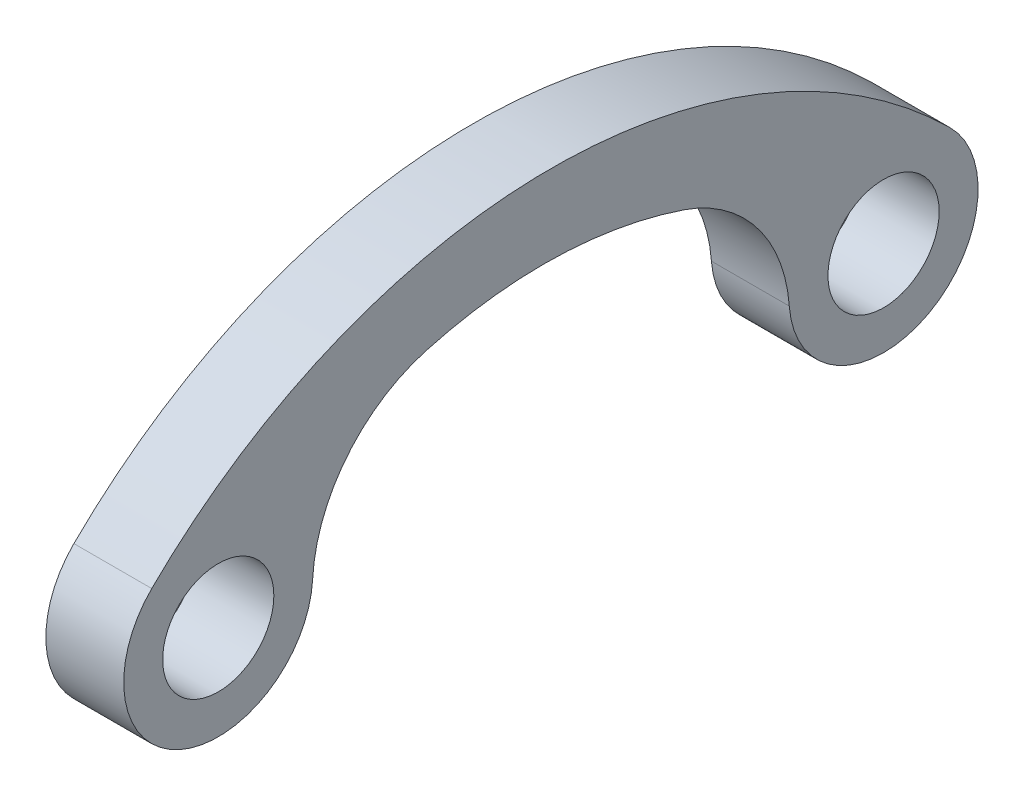
ISO-10303-21;
HEADER;
FILE_DESCRIPTION(('STEP AP214'),'2;1');
FILE_NAME('part.step','',(''),(''),'','','');
FILE_SCHEMA(('AUTOMOTIVE_DESIGN { 1 0 10303 214 1 1 1 1 }'));
ENDSEC;
DATA;
#1=APPLICATION_CONTEXT('core data for automotive mechanical design processes');
#2=APPLICATION_PROTOCOL_DEFINITION('international standard','automotive_design',2000,#1);
#3=PRODUCT_CONTEXT('',#1,'mechanical');
#4=PRODUCT('Part','Part','',(#3));
#5=PRODUCT_RELATED_PRODUCT_CATEGORY('part','',(#4));
#6=PRODUCT_DEFINITION_FORMATION('','',#4);
#7=PRODUCT_DEFINITION_CONTEXT('part definition',#1,'design');
#8=PRODUCT_DEFINITION('design','',#6,#7);
#9=PRODUCT_DEFINITION_SHAPE('','',#8);
#10=(LENGTH_UNIT() NAMED_UNIT(*) SI_UNIT(.MILLI.,.METRE.));
#11=(NAMED_UNIT(*) PLANE_ANGLE_UNIT() SI_UNIT($,.RADIAN.));
#12=(NAMED_UNIT(*) SI_UNIT($,.STERADIAN.) SOLID_ANGLE_UNIT());
#13=UNCERTAINTY_MEASURE_WITH_UNIT(LENGTH_MEASURE(1.E-05),#10,'distance_accuracy_value','');
#14=(GEOMETRIC_REPRESENTATION_CONTEXT(3) GLOBAL_UNCERTAINTY_ASSIGNED_CONTEXT((#13)) GLOBAL_UNIT_ASSIGNED_CONTEXT((#10,
#11,#12)) REPRESENTATION_CONTEXT('',''));
#15=CARTESIAN_POINT('',(0.,0.,0.));
#16=DIRECTION('',(0.,0.,1.));
#17=DIRECTION('',(1.,0.,0.));
#18=AXIS2_PLACEMENT_3D('',#15,#16,#17);
#19=CARTESIAN_POINT('',(5.,-10.7894564722716,10.68));
#20=DIRECTION('',(1.,0.,0.));
#21=DIRECTION('',(0.,0.,-1.));
#22=AXIS2_PLACEMENT_3D('',#19,#20,#21);
#23=PLANE('',#22);
#24=CARTESIAN_POINT('',(5.,0.,0.));
#25=DIRECTION('',(1.,0.,0.));
#26=DIRECTION('',(0.,0.,-1.));
#27=AXIS2_PLACEMENT_3D('',#24,#25,#26);
#28=CIRCLE('',#27,3.57);
#29=CARTESIAN_POINT('',(5.,0.,-3.57));
#30=VERTEX_POINT('',#29);
#31=EDGE_CURVE('E134',#30,#30,#28,.T.);
#32=ORIENTED_EDGE('',*,*,#31,.F.);
#33=EDGE_LOOP('',(#32));
#34=FACE_BOUND('',#33,.T.);
#35=CARTESIAN_POINT('',(5.,0.,0.));
#36=DIRECTION('',(1.,0.,0.));
#37=DIRECTION('',(0.,0.,-1.));
#38=AXIS2_PLACEMENT_3D('',#35,#36,#37);
#39=CIRCLE('',#38,6.07000000000001);
#40=CARTESIAN_POINT('',(5.,-0.44795040481959,6.05344863981038));
#41=VERTEX_POINT('',#40);
#42=CARTESIAN_POINT('',(5.,4.31396445430394,-4.27020030993888));
#43=VERTEX_POINT('',#42);
#44=EDGE_CURVE('E146',#41,#43,#39,.T.);
#45=ORIENTED_EDGE('',*,*,#44,.T.);
#46=CARTESIAN_POINT('',(5.,-21.5789129445431,21.36));
#47=DIRECTION('',(1.,0.,0.));
#48=DIRECTION('',(0.,0.,-1.));
#49=AXIS2_PLACEMENT_3D('',#46,#47,#48);
#50=CIRCLE('',#49,36.4327911080021);
#51=CARTESIAN_POINT('',(5.,4.31396445430393,46.9902003099389));
#52=VERTEX_POINT('',#51);
#53=EDGE_CURVE('E94',#43,#52,#50,.T.);
#54=ORIENTED_EDGE('',*,*,#53,.T.);
#55=CARTESIAN_POINT('',(5.,0.,42.72));
#56=DIRECTION('',(1.,0.,0.));
#57=DIRECTION('',(0.,0.,-1.));
#58=AXIS2_PLACEMENT_3D('',#55,#56,#57);
#59=CIRCLE('',#58,6.06999999999999);
#60=CARTESIAN_POINT('',(5.,-0.338492916093118,36.6594453598903));
#61=VERTEX_POINT('',#60);
#62=EDGE_CURVE('E107',#52,#61,#59,.T.);
#63=ORIENTED_EDGE('',*,*,#62,.T.);
#64=CARTESIAN_POINT('',(5.,-0.896141871765454,26.6750060845861));
#65=DIRECTION('',(-1.,0.,0.));
#66=DIRECTION('',(0.,0.,-1.));
#67=AXIS2_PLACEMENT_3D('',#64,#65,#66);
#68=CIRCLE('',#67,10.);
#69=CARTESIAN_POINT('',(5.,8.73212241093731,29.3762144998015));
#70=VERTEX_POINT('',#69);
#71=EDGE_CURVE('E101',#61,#70,#68,.T.);
#72=ORIENTED_EDGE('',*,*,#71,.T.);
#73=CARTESIAN_POINT('',(5.,-18.2093448184513,21.817789028555));
#74=DIRECTION('',(-1.,0.,0.));
#75=DIRECTION('',(0.,0.,-1.));
#76=AXIS2_PLACEMENT_3D('',#73,#74,#75);
#77=CIRCLE('',#76,27.9816449137039);
#78=CARTESIAN_POINT('',(5.,8.28118476907602,12.8053368512091));
#79=VERTEX_POINT('',#78);
#80=EDGE_CURVE('E105',#70,#79,#77,.T.);
#81=ORIENTED_EDGE('',*,*,#80,.T.);
#82=CARTESIAN_POINT('',(5.,-1.18592471259486,16.026181160091));
#83=DIRECTION('',(-1.,0.,0.));
#84=DIRECTION('',(0.,0.,1.));
#85=AXIS2_PLACEMENT_3D('',#82,#83,#84);
#86=CIRCLE('',#85,10.);
#87=EDGE_CURVE('E57',#79,#41,#86,.T.);
#88=ORIENTED_EDGE('',*,*,#87,.T.);
#89=EDGE_LOOP('',(#45,#54,#63,#72,#81,#88));
#90=FACE_BOUND('',#89,.T.);
#91=CARTESIAN_POINT('',(5.,0.,42.72));
#92=DIRECTION('',(1.,0.,0.));
#93=DIRECTION('',(0.,0.,-1.));
#94=AXIS2_PLACEMENT_3D('',#91,#92,#93);
#95=CIRCLE('',#94,3.57);
#96=CARTESIAN_POINT('',(5.,0.,39.15));
#97=VERTEX_POINT('',#96);
#98=EDGE_CURVE('E192',#97,#97,#95,.T.);
#99=ORIENTED_EDGE('',*,*,#98,.F.);
#100=EDGE_LOOP('',(#99));
#101=FACE_BOUND('',#100,.T.);
#102=ADVANCED_FACE('F39',(#34,#90,#101),#23,.T.);
#103=CARTESIAN_POINT('',(0.,-10.7894564722716,10.68));
#104=DIRECTION('',(1.,0.,0.));
#105=DIRECTION('',(0.,0.,-1.));
#106=AXIS2_PLACEMENT_3D('',#103,#104,#105);
#107=PLANE('',#106);
#108=CARTESIAN_POINT('',(0.,0.,0.));
#109=DIRECTION('',(1.,0.,0.));
#110=DIRECTION('',(0.,0.,-1.));
#111=AXIS2_PLACEMENT_3D('',#108,#109,#110);
#112=CIRCLE('',#111,6.07000000000001);
#113=CARTESIAN_POINT('',(0.,-0.44795040481959,6.05344863981038));
#114=VERTEX_POINT('',#113);
#115=CARTESIAN_POINT('',(0.,4.31396445430394,-4.27020030993888));
#116=VERTEX_POINT('',#115);
#117=EDGE_CURVE('E129',#114,#116,#112,.T.);
#118=ORIENTED_EDGE('',*,*,#117,.F.);
#119=CARTESIAN_POINT('',(0.,-1.18592471259486,16.026181160091));
#120=DIRECTION('',(-1.,0.,0.));
#121=DIRECTION('',(0.,0.,1.));
#122=AXIS2_PLACEMENT_3D('',#119,#120,#121);
#123=CIRCLE('',#122,10.);
#124=CARTESIAN_POINT('',(0.,8.28118476907602,12.8053368512091));
#125=VERTEX_POINT('',#124);
#126=EDGE_CURVE('E86',#125,#114,#123,.T.);
#127=ORIENTED_EDGE('',*,*,#126,.F.);
#128=CARTESIAN_POINT('',(0.,-18.2093448184513,21.817789028555));
#129=DIRECTION('',(-1.,0.,0.));
#130=DIRECTION('',(0.,0.,-1.));
#131=AXIS2_PLACEMENT_3D('',#128,#129,#130);
#132=CIRCLE('',#131,27.9816449137039);
#133=CARTESIAN_POINT('',(0.,8.73212241093731,29.3762144998015));
#134=VERTEX_POINT('',#133);
#135=EDGE_CURVE('E80',#134,#125,#132,.T.);
#136=ORIENTED_EDGE('',*,*,#135,.F.);
#137=CARTESIAN_POINT('',(0.,-0.896141871765454,26.6750060845861));
#138=DIRECTION('',(-1.,0.,0.));
#139=DIRECTION('',(0.,0.,-1.));
#140=AXIS2_PLACEMENT_3D('',#137,#138,#139);
#141=CIRCLE('',#140,10.);
#142=CARTESIAN_POINT('',(0.,-0.338492916093118,36.6594453598903));
#143=VERTEX_POINT('',#142);
#144=EDGE_CURVE('E116',#143,#134,#141,.T.);
#145=ORIENTED_EDGE('',*,*,#144,.F.);
#146=CARTESIAN_POINT('',(0.,0.,42.72));
#147=DIRECTION('',(1.,0.,0.));
#148=DIRECTION('',(0.,0.,-1.));
#149=AXIS2_PLACEMENT_3D('',#146,#147,#148);
#150=CIRCLE('',#149,6.06999999999999);
#151=CARTESIAN_POINT('',(0.,4.31396445430393,46.9902003099389));
#152=VERTEX_POINT('',#151);
#153=EDGE_CURVE('E137',#152,#143,#150,.T.);
#154=ORIENTED_EDGE('',*,*,#153,.F.);
#155=CARTESIAN_POINT('',(0.,-21.5789129445431,21.36));
#156=DIRECTION('',(1.,0.,0.));
#157=DIRECTION('',(0.,0.,-1.));
#158=AXIS2_PLACEMENT_3D('',#155,#156,#157);
#159=CIRCLE('',#158,36.4327911080021);
#160=EDGE_CURVE('E133',#116,#152,#159,.T.);
#161=ORIENTED_EDGE('',*,*,#160,.F.);
#162=EDGE_LOOP('',(#118,#127,#136,#145,#154,#161));
#163=FACE_BOUND('',#162,.T.);
#164=CARTESIAN_POINT('',(0.,0.,0.));
#165=DIRECTION('',(1.,0.,0.));
#166=DIRECTION('',(0.,0.,-1.));
#167=AXIS2_PLACEMENT_3D('',#164,#165,#166);
#168=CIRCLE('',#167,3.57);
#169=CARTESIAN_POINT('',(0.,0.,-3.57));
#170=VERTEX_POINT('',#169);
#171=EDGE_CURVE('E200',#170,#170,#168,.T.);
#172=ORIENTED_EDGE('',*,*,#171,.T.);
#173=EDGE_LOOP('',(#172));
#174=FACE_BOUND('',#173,.T.);
#175=CARTESIAN_POINT('',(0.,0.,42.72));
#176=DIRECTION('',(1.,0.,0.));
#177=DIRECTION('',(0.,0.,-1.));
#178=AXIS2_PLACEMENT_3D('',#175,#176,#177);
#179=CIRCLE('',#178,3.57);
#180=CARTESIAN_POINT('',(0.,0.,39.15));
#181=VERTEX_POINT('',#180);
#182=EDGE_CURVE('E195',#181,#181,#179,.T.);
#183=ORIENTED_EDGE('',*,*,#182,.T.);
#184=EDGE_LOOP('',(#183));
#185=FACE_BOUND('',#184,.T.);
#186=ADVANCED_FACE('F159',(#163,#174,#185),#107,.F.);
#187=CARTESIAN_POINT('',(5.,0.,0.));
#188=DIRECTION('',(-1.,0.,0.));
#189=DIRECTION('',(0.,0.,1.));
#190=AXIS2_PLACEMENT_3D('',#187,#188,#189);
#191=CYLINDRICAL_SURFACE('',#190,6.07000000000001);
#192=ORIENTED_EDGE('',*,*,#117,.T.);
#193=DIRECTION('',(-1.,0.,0.));
#194=VECTOR('',#193,1.);
#195=CARTESIAN_POINT('',(5.,4.31396445430394,-4.27020030993888));
#196=LINE('',#195,#194);
#197=EDGE_CURVE('E11',#43,#116,#196,.T.);
#198=ORIENTED_EDGE('',*,*,#197,.F.);
#199=ORIENTED_EDGE('',*,*,#44,.F.);
#200=DIRECTION('',(-1.,0.,0.));
#201=VECTOR('',#200,1.);
#202=CARTESIAN_POINT('',(5.,-0.44795040481959,6.05344863981038));
#203=LINE('',#202,#201);
#204=EDGE_CURVE('E125',#41,#114,#203,.T.);
#205=ORIENTED_EDGE('',*,*,#204,.T.);
#206=EDGE_LOOP('',(#192,#198,#199,#205));
#207=FACE_BOUND('',#206,.T.);
#208=ADVANCED_FACE('F41',(#207),#191,.T.);
#209=CARTESIAN_POINT('',(5.,-21.5789129445431,21.36));
#210=DIRECTION('',(-1.,0.,0.));
#211=DIRECTION('',(0.,0.,1.));
#212=AXIS2_PLACEMENT_3D('',#209,#210,#211);
#213=CYLINDRICAL_SURFACE('',#212,36.4327911080021);
#214=ORIENTED_EDGE('',*,*,#160,.T.);
#215=DIRECTION('',(-1.,0.,0.));
#216=VECTOR('',#215,1.);
#217=CARTESIAN_POINT('',(5.,4.31396445430393,46.9902003099389));
#218=LINE('',#217,#216);
#219=EDGE_CURVE('E49',#52,#152,#218,.T.);
#220=ORIENTED_EDGE('',*,*,#219,.F.);
#221=ORIENTED_EDGE('',*,*,#53,.F.);
#222=ORIENTED_EDGE('',*,*,#197,.T.);
#223=EDGE_LOOP('',(#214,#220,#221,#222));
#224=FACE_BOUND('',#223,.T.);
#225=ADVANCED_FACE('F246',(#224),#213,.T.);
#226=CARTESIAN_POINT('',(5.,0.,42.72));
#227=DIRECTION('',(-1.,0.,0.));
#228=DIRECTION('',(0.,0.,1.));
#229=AXIS2_PLACEMENT_3D('',#226,#227,#228);
#230=CYLINDRICAL_SURFACE('',#229,6.06999999999999);
#231=ORIENTED_EDGE('',*,*,#153,.T.);
#232=DIRECTION('',(-1.,0.,0.));
#233=VECTOR('',#232,1.);
#234=CARTESIAN_POINT('',(5.,-0.338492916093118,36.6594453598903));
#235=LINE('',#234,#233);
#236=EDGE_CURVE('E118',#61,#143,#235,.T.);
#237=ORIENTED_EDGE('',*,*,#236,.F.);
#238=ORIENTED_EDGE('',*,*,#62,.F.);
#239=ORIENTED_EDGE('',*,*,#219,.T.);
#240=EDGE_LOOP('',(#231,#237,#238,#239));
#241=FACE_BOUND('',#240,.T.);
#242=ADVANCED_FACE('F156',(#241),#230,.T.);
#243=CARTESIAN_POINT('',(5.,-0.896141871765454,26.6750060845861));
#244=DIRECTION('',(-1.,0.,0.));
#245=DIRECTION('',(0.,0.,1.));
#246=AXIS2_PLACEMENT_3D('',#243,#244,#245);
#247=CYLINDRICAL_SURFACE('',#246,10.);
#248=ORIENTED_EDGE('',*,*,#144,.T.);
#249=DIRECTION('',(-1.,0.,0.));
#250=VECTOR('',#249,1.);
#251=CARTESIAN_POINT('',(5.,8.73212241093731,29.3762144998015));
#252=LINE('',#251,#250);
#253=EDGE_CURVE('E113',#70,#134,#252,.T.);
#254=ORIENTED_EDGE('',*,*,#253,.F.);
#255=ORIENTED_EDGE('',*,*,#71,.F.);
#256=ORIENTED_EDGE('',*,*,#236,.T.);
#257=EDGE_LOOP('',(#248,#254,#255,#256));
#258=FACE_BOUND('',#257,.T.);
#259=ADVANCED_FACE('F114',(#258),#247,.F.);
#260=CARTESIAN_POINT('',(5.,-18.2093448184513,21.817789028555));
#261=DIRECTION('',(-1.,0.,0.));
#262=DIRECTION('',(0.,0.,1.));
#263=AXIS2_PLACEMENT_3D('',#260,#261,#262);
#264=CYLINDRICAL_SURFACE('',#263,27.9816449137039);
#265=ORIENTED_EDGE('',*,*,#135,.T.);
#266=DIRECTION('',(-1.,0.,0.));
#267=VECTOR('',#266,1.);
#268=CARTESIAN_POINT('',(5.,8.28118476907602,12.8053368512091));
#269=LINE('',#268,#267);
#270=EDGE_CURVE('E119',#79,#125,#269,.T.);
#271=ORIENTED_EDGE('',*,*,#270,.F.);
#272=ORIENTED_EDGE('',*,*,#80,.F.);
#273=ORIENTED_EDGE('',*,*,#253,.T.);
#274=EDGE_LOOP('',(#265,#271,#272,#273));
#275=FACE_BOUND('',#274,.T.);
#276=ADVANCED_FACE('F121',(#275),#264,.F.);
#277=CARTESIAN_POINT('',(5.,-1.18592471259486,16.026181160091));
#278=DIRECTION('',(-1.,0.,0.));
#279=DIRECTION('',(0.,0.,1.));
#280=AXIS2_PLACEMENT_3D('',#277,#278,#279);
#281=CYLINDRICAL_SURFACE('',#280,10.);
#282=ORIENTED_EDGE('',*,*,#126,.T.);
#283=ORIENTED_EDGE('',*,*,#204,.F.);
#284=ORIENTED_EDGE('',*,*,#87,.F.);
#285=ORIENTED_EDGE('',*,*,#270,.T.);
#286=EDGE_LOOP('',(#282,#283,#284,#285));
#287=FACE_BOUND('',#286,.T.);
#288=ADVANCED_FACE('F164',(#287),#281,.F.);
#289=CARTESIAN_POINT('',(5.,0.,0.));
#290=DIRECTION('',(-1.,0.,0.));
#291=DIRECTION('',(0.,0.,1.));
#292=AXIS2_PLACEMENT_3D('',#289,#290,#291);
#293=CYLINDRICAL_SURFACE('',#292,3.57);
#294=ORIENTED_EDGE('',*,*,#31,.T.);
#295=EDGE_LOOP('',(#294));
#296=FACE_BOUND('',#295,.T.);
#297=ORIENTED_EDGE('',*,*,#171,.F.);
#298=EDGE_LOOP('',(#297));
#299=FACE_BOUND('',#298,.T.);
#300=ADVANCED_FACE('F166',(#296,#299),#293,.F.);
#301=CARTESIAN_POINT('',(5.,0.,42.72));
#302=DIRECTION('',(-1.,0.,0.));
#303=DIRECTION('',(0.,0.,1.));
#304=AXIS2_PLACEMENT_3D('',#301,#302,#303);
#305=CYLINDRICAL_SURFACE('',#304,3.57);
#306=ORIENTED_EDGE('',*,*,#98,.T.);
#307=EDGE_LOOP('',(#306));
#308=FACE_BOUND('',#307,.T.);
#309=ORIENTED_EDGE('',*,*,#182,.F.);
#310=EDGE_LOOP('',(#309));
#311=FACE_BOUND('',#310,.T.);
#312=ADVANCED_FACE('F172',(#308,#311),#305,.F.);
#313=CLOSED_SHELL('',(#102,#186,#208,#225,#242,#259,#276,#288,#300,#312));
#314=MANIFOLD_SOLID_BREP('B2',#313);
#315=ADVANCED_BREP_SHAPE_REPRESENTATION('',(#18,#314),#14);
#316=SHAPE_DEFINITION_REPRESENTATION(#9,#315);
ENDSEC;
END-ISO-10303-21;
